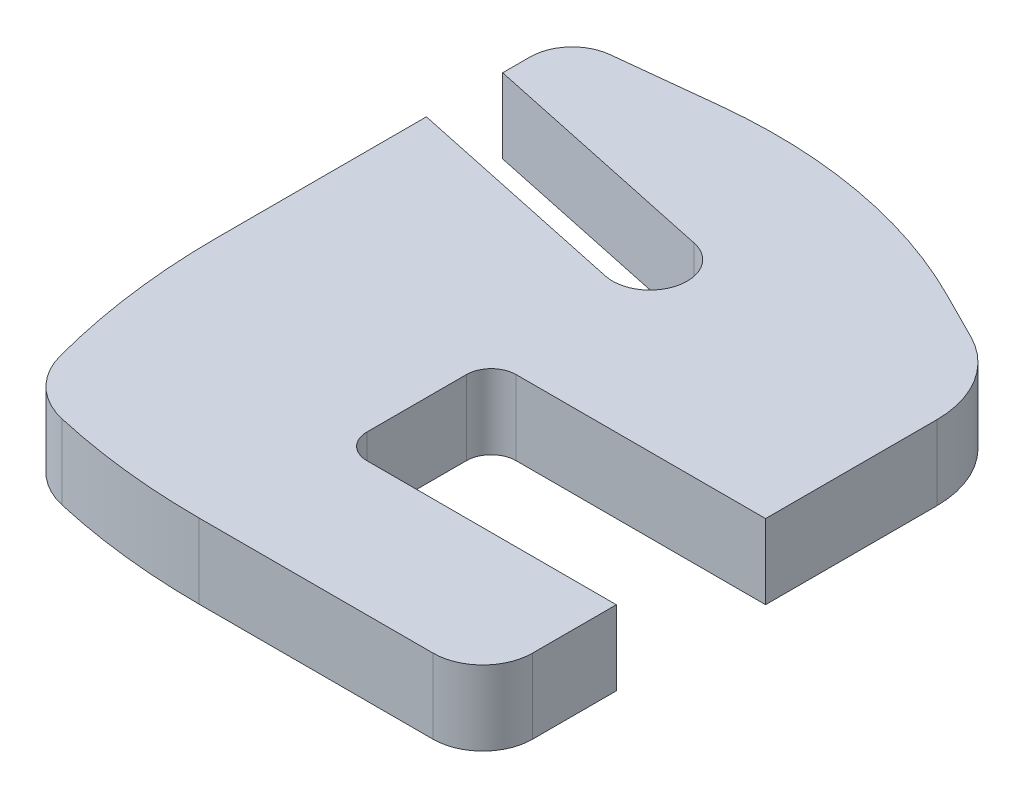
ISO-10303-21;
HEADER;
FILE_DESCRIPTION(('STEP AP214'),'2;1');
FILE_NAME('part.step','',(''),(''),'','','');
FILE_SCHEMA(('AUTOMOTIVE_DESIGN { 1 0 10303 214 1 1 1 1 }'));
ENDSEC;
DATA;
#1=APPLICATION_CONTEXT('core data for automotive mechanical design processes');
#2=APPLICATION_PROTOCOL_DEFINITION('international standard','automotive_design',2000,#1);
#3=PRODUCT_CONTEXT('',#1,'mechanical');
#4=PRODUCT('Part','Part','',(#3));
#5=PRODUCT_RELATED_PRODUCT_CATEGORY('part','',(#4));
#6=PRODUCT_DEFINITION_FORMATION('','',#4);
#7=PRODUCT_DEFINITION_CONTEXT('part definition',#1,'design');
#8=PRODUCT_DEFINITION('design','',#6,#7);
#9=PRODUCT_DEFINITION_SHAPE('','',#8);
#10=(LENGTH_UNIT() NAMED_UNIT(*) SI_UNIT(.MILLI.,.METRE.));
#11=(NAMED_UNIT(*) PLANE_ANGLE_UNIT() SI_UNIT($,.RADIAN.));
#12=(NAMED_UNIT(*) SI_UNIT($,.STERADIAN.) SOLID_ANGLE_UNIT());
#13=UNCERTAINTY_MEASURE_WITH_UNIT(LENGTH_MEASURE(1.E-05),#10,'distance_accuracy_value','');
#14=(GEOMETRIC_REPRESENTATION_CONTEXT(3) GLOBAL_UNCERTAINTY_ASSIGNED_CONTEXT((#13)) GLOBAL_UNIT_ASSIGNED_CONTEXT((#10,
#11,#12)) REPRESENTATION_CONTEXT('',''));
#15=CARTESIAN_POINT('',(0.,0.,0.));
#16=DIRECTION('',(0.,0.,1.));
#17=DIRECTION('',(1.,0.,0.));
#18=AXIS2_PLACEMENT_3D('',#15,#16,#17);
#19=CARTESIAN_POINT('',(-10.03,3.,-6.));
#20=DIRECTION('',(0.,0.,-1.));
#21=DIRECTION('',(-1.,0.,0.));
#22=AXIS2_PLACEMENT_3D('',#19,#20,#21);
#23=PLANE('',#22);
#24=DIRECTION('',(1.,0.,0.));
#25=VECTOR('',#24,1.);
#26=CARTESIAN_POINT('',(-10.03,0.,-6.));
#27=LINE('',#26,#25);
#28=CARTESIAN_POINT('',(-10.03,0.,-6.));
#29=VERTEX_POINT('',#28);
#30=CARTESIAN_POINT('',(0.,0.,-6.));
#31=VERTEX_POINT('',#30);
#32=EDGE_CURVE('E213',#29,#31,#27,.T.);
#33=ORIENTED_EDGE('',*,*,#32,.T.);
#34=DIRECTION('',(0.,-1.,0.));
#35=VECTOR('',#34,1.);
#36=CARTESIAN_POINT('',(0.,3.,-6.));
#37=LINE('',#36,#35);
#38=CARTESIAN_POINT('',(0.,3.,-6.));
#39=VERTEX_POINT('',#38);
#40=EDGE_CURVE('E11',#39,#31,#37,.T.);
#41=ORIENTED_EDGE('',*,*,#40,.F.);
#42=DIRECTION('',(1.,0.,0.));
#43=VECTOR('',#42,1.);
#44=CARTESIAN_POINT('',(-10.03,3.,-6.));
#45=LINE('',#44,#43);
#46=CARTESIAN_POINT('',(-10.03,3.,-6.));
#47=VERTEX_POINT('',#46);
#48=EDGE_CURVE('E255',#47,#39,#45,.T.);
#49=ORIENTED_EDGE('',*,*,#48,.F.);
#50=DIRECTION('',(0.,-1.,0.));
#51=VECTOR('',#50,1.);
#52=CARTESIAN_POINT('',(-10.03,3.,-6.));
#53=LINE('',#52,#51);
#54=EDGE_CURVE('E209',#47,#29,#53,.T.);
#55=ORIENTED_EDGE('',*,*,#54,.T.);
#56=EDGE_LOOP('',(#33,#41,#49,#55));
#57=FACE_BOUND('',#56,.T.);
#58=ADVANCED_FACE('F33',(#57),#23,.F.);
#59=CARTESIAN_POINT('',(0.,3.,-6.));
#60=DIRECTION('',(-1.,0.,0.));
#61=DIRECTION('',(0.,0.,1.));
#62=AXIS2_PLACEMENT_3D('',#59,#60,#61);
#63=PLANE('',#62);
#64=DIRECTION('',(0.,0.,-1.));
#65=VECTOR('',#64,1.);
#66=CARTESIAN_POINT('',(0.,0.,-6.));
#67=LINE('',#66,#65);
#68=CARTESIAN_POINT('',(0.,0.,-12.8856070370507));
#69=VERTEX_POINT('',#68);
#70=EDGE_CURVE('E216',#31,#69,#67,.T.);
#71=ORIENTED_EDGE('',*,*,#70,.T.);
#72=DIRECTION('',(0.,-1.,0.));
#73=VECTOR('',#72,1.);
#74=CARTESIAN_POINT('',(0.,3.,-12.8856070370507));
#75=LINE('',#74,#73);
#76=CARTESIAN_POINT('',(0.,3.,-12.8856070370507));
#77=VERTEX_POINT('',#76);
#78=EDGE_CURVE('E41',#77,#69,#75,.T.);
#79=ORIENTED_EDGE('',*,*,#78,.F.);
#80=DIRECTION('',(0.,0.,-1.));
#81=VECTOR('',#80,1.);
#82=CARTESIAN_POINT('',(0.,3.,-6.));
#83=LINE('',#82,#81);
#84=EDGE_CURVE('E134',#39,#77,#83,.T.);
#85=ORIENTED_EDGE('',*,*,#84,.F.);
#86=ORIENTED_EDGE('',*,*,#40,.T.);
#87=EDGE_LOOP('',(#71,#79,#85,#86));
#88=FACE_BOUND('',#87,.T.);
#89=ADVANCED_FACE('F383',(#88),#63,.F.);
#90=CARTESIAN_POINT('',(-4.,3.,-12.8856070370507));
#91=DIRECTION('',(0.,-1.,0.));
#92=DIRECTION('',(0.,0.,-1.));
#93=AXIS2_PLACEMENT_3D('',#90,#91,#92);
#94=CYLINDRICAL_SURFACE('',#93,4.);
#95=CARTESIAN_POINT('',(-4.,0.,-12.8856070370507));
#96=DIRECTION('',(0.,1.,0.));
#97=DIRECTION('',(0.,0.,1.));
#98=AXIS2_PLACEMENT_3D('',#95,#96,#97);
#99=CIRCLE('',#98,4.);
#100=CARTESIAN_POINT('',(-2.20112124581843,0.,-16.458286035751));
#101=VERTEX_POINT('',#100);
#102=EDGE_CURVE('E218',#69,#101,#99,.T.);
#103=ORIENTED_EDGE('',*,*,#102,.T.);
#104=DIRECTION('',(0.,-1.,0.));
#105=VECTOR('',#104,1.);
#106=CARTESIAN_POINT('',(-2.20112124581843,3.,-16.458286035751));
#107=LINE('',#106,#105);
#108=CARTESIAN_POINT('',(-2.20112124581843,3.,-16.458286035751));
#109=VERTEX_POINT('',#108);
#110=EDGE_CURVE('E304',#109,#101,#107,.T.);
#111=ORIENTED_EDGE('',*,*,#110,.F.);
#112=CARTESIAN_POINT('',(-4.,3.,-12.8856070370507));
#113=DIRECTION('',(0.,1.,0.));
#114=DIRECTION('',(0.,0.,1.));
#115=AXIS2_PLACEMENT_3D('',#112,#113,#114);
#116=CIRCLE('',#115,4.);
#117=EDGE_CURVE('E312',#77,#109,#116,.T.);
#118=ORIENTED_EDGE('',*,*,#117,.F.);
#119=ORIENTED_EDGE('',*,*,#78,.T.);
#120=EDGE_LOOP('',(#103,#111,#118,#119));
#121=FACE_BOUND('',#120,.T.);
#122=ADVANCED_FACE('F310',(#121),#94,.T.);
#123=CARTESIAN_POINT('',(-2.20112124581843,3.,-16.458286035751));
#124=DIRECTION('',(-0.449719688545393,0.,0.893169749675074));
#125=DIRECTION('',(0.893169749675074,0.,0.449719688545393));
#126=AXIS2_PLACEMENT_3D('',#123,#124,#125);
#127=PLANE('',#126);
#128=DIRECTION('',(-0.893169749675074,0.,-0.449719688545393));
#129=VECTOR('',#128,1.);
#130=CARTESIAN_POINT('',(-2.20112124581843,0.,-16.458286035751));
#131=LINE('',#130,#129);
#132=CARTESIAN_POINT('',(-4.1545055907025,0.,-17.4418341233461));
#133=VERTEX_POINT('',#132);
#134=EDGE_CURVE('E220',#101,#133,#131,.T.);
#135=ORIENTED_EDGE('',*,*,#134,.T.);
#136=DIRECTION('',(0.,-1.,0.));
#137=VECTOR('',#136,1.);
#138=CARTESIAN_POINT('',(-4.1545055907025,3.,-17.4418341233461));
#139=LINE('',#138,#137);
#140=CARTESIAN_POINT('',(-4.1545055907025,3.,-17.4418341233461));
#141=VERTEX_POINT('',#140);
#142=EDGE_CURVE('E301',#141,#133,#139,.T.);
#143=ORIENTED_EDGE('',*,*,#142,.F.);
#144=DIRECTION('',(-0.893169749675074,0.,-0.449719688545393));
#145=VECTOR('',#144,1.);
#146=CARTESIAN_POINT('',(-2.20112124581843,3.,-16.458286035751));
#147=LINE('',#146,#145);
#148=EDGE_CURVE('E330',#109,#141,#147,.T.);
#149=ORIENTED_EDGE('',*,*,#148,.F.);
#150=ORIENTED_EDGE('',*,*,#110,.T.);
#151=EDGE_LOOP('',(#135,#143,#149,#150));
#152=FACE_BOUND('',#151,.T.);
#153=ADVANCED_FACE('F321',(#152),#127,.F.);
#154=CARTESIAN_POINT('',(-13.1488993616103,3.,0.421560870155395));
#155=DIRECTION('',(0.,-1.,0.));
#156=DIRECTION('',(0.,0.,-1.));
#157=AXIS2_PLACEMENT_3D('',#154,#155,#156);
#158=CYLINDRICAL_SURFACE('',#157,20.);
#159=CARTESIAN_POINT('',(-13.1488993616103,0.,0.421560870155395));
#160=DIRECTION('',(0.,1.,0.));
#161=DIRECTION('',(0.,0.,1.));
#162=AXIS2_PLACEMENT_3D('',#159,#160,#161);
#163=CIRCLE('',#162,20.);
#164=CARTESIAN_POINT('',(-15.3098922070051,0.,-19.4613491261744));
#165=VERTEX_POINT('',#164);
#166=EDGE_CURVE('E222',#133,#165,#163,.T.);
#167=ORIENTED_EDGE('',*,*,#166,.T.);
#168=DIRECTION('',(0.,-1.,0.));
#169=VECTOR('',#168,1.);
#170=CARTESIAN_POINT('',(-15.3098922070051,3.,-19.4613491261744));
#171=LINE('',#170,#169);
#172=CARTESIAN_POINT('',(-15.3098922070051,3.,-19.4613491261744));
#173=VERTEX_POINT('',#172);
#174=EDGE_CURVE('E298',#173,#165,#171,.T.);
#175=ORIENTED_EDGE('',*,*,#174,.F.);
#176=CARTESIAN_POINT('',(-13.1488993616103,3.,0.421560870155395));
#177=DIRECTION('',(0.,1.,0.));
#178=DIRECTION('',(0.,0.,1.));
#179=AXIS2_PLACEMENT_3D('',#176,#177,#178);
#180=CIRCLE('',#179,20.);
#181=EDGE_CURVE('E327',#141,#173,#180,.T.);
#182=ORIENTED_EDGE('',*,*,#181,.F.);
#183=ORIENTED_EDGE('',*,*,#142,.T.);
#184=EDGE_LOOP('',(#167,#175,#182,#183));
#185=FACE_BOUND('',#184,.T.);
#186=ADVANCED_FACE('F325',(#185),#158,.T.);
#187=CARTESIAN_POINT('',(-15.3098922070051,3.,-19.4613491261744));
#188=DIRECTION('',(0.108049642269737,0.,0.994145499816491));
#189=DIRECTION('',(0.994145499816492,0.,-0.108049642269737));
#190=AXIS2_PLACEMENT_3D('',#187,#188,#189);
#191=PLANE('',#190);
#192=DIRECTION('',(-0.994145499816492,0.,0.108049642269737));
#193=VECTOR('',#192,1.);
#194=CARTESIAN_POINT('',(-15.3098922070051,0.,-19.4613491261744));
#195=LINE('',#194,#193);
#196=CARTESIAN_POINT('',(-19.2936843918586,0.,-19.0283669112674));
#197=VERTEX_POINT('',#196);
#198=EDGE_CURVE('E224',#165,#197,#195,.T.);
#199=ORIENTED_EDGE('',*,*,#198,.T.);
#200=DIRECTION('',(0.,-1.,0.));
#201=VECTOR('',#200,1.);
#202=CARTESIAN_POINT('',(-19.2936843918586,3.,-19.0283669112674));
#203=LINE('',#202,#201);
#204=CARTESIAN_POINT('',(-19.2936843918586,3.,-19.0283669112674));
#205=VERTEX_POINT('',#204);
#206=EDGE_CURVE('E295',#205,#197,#203,.T.);
#207=ORIENTED_EDGE('',*,*,#206,.F.);
#208=DIRECTION('',(-0.994145499816492,0.,0.108049642269737));
#209=VECTOR('',#208,1.);
#210=CARTESIAN_POINT('',(-15.3098922070051,3.,-19.4613491261744));
#211=LINE('',#210,#209);
#212=EDGE_CURVE('E329',#173,#205,#211,.T.);
#213=ORIENTED_EDGE('',*,*,#212,.F.);
#214=ORIENTED_EDGE('',*,*,#174,.T.);
#215=EDGE_LOOP('',(#199,#207,#213,#214));
#216=FACE_BOUND('',#215,.T.);
#217=ADVANCED_FACE('F396',(#216),#191,.F.);
#218=CARTESIAN_POINT('',(-19.11,3.,-17.3383195615794));
#219=DIRECTION('',(0.,-1.,0.));
#220=DIRECTION('',(0.,0.,-1.));
#221=AXIS2_PLACEMENT_3D('',#218,#219,#220);
#222=CYLINDRICAL_SURFACE('',#221,1.7);
#223=CARTESIAN_POINT('',(-19.11,0.,-17.3383195615794));
#224=DIRECTION('',(0.,1.,0.));
#225=DIRECTION('',(0.,0.,1.));
#226=AXIS2_PLACEMENT_3D('',#223,#224,#225);
#227=CIRCLE('',#226,1.7);
#228=CARTESIAN_POINT('',(-20.81,0.,-17.3383195615794));
#229=VERTEX_POINT('',#228);
#230=EDGE_CURVE('E226',#197,#229,#227,.T.);
#231=ORIENTED_EDGE('',*,*,#230,.T.);
#232=DIRECTION('',(0.,-1.,0.));
#233=VECTOR('',#232,1.);
#234=CARTESIAN_POINT('',(-20.81,3.,-17.3383195615794));
#235=LINE('',#234,#233);
#236=CARTESIAN_POINT('',(-20.81,3.,-17.3383195615794));
#237=VERTEX_POINT('',#236);
#238=EDGE_CURVE('E292',#237,#229,#235,.T.);
#239=ORIENTED_EDGE('',*,*,#238,.F.);
#240=CARTESIAN_POINT('',(-19.11,3.,-17.3383195615794));
#241=DIRECTION('',(0.,1.,0.));
#242=DIRECTION('',(0.,0.,1.));
#243=AXIS2_PLACEMENT_3D('',#240,#241,#242);
#244=CIRCLE('',#243,1.7);
#245=EDGE_CURVE('E332',#205,#237,#244,.T.);
#246=ORIENTED_EDGE('',*,*,#245,.F.);
#247=ORIENTED_EDGE('',*,*,#206,.T.);
#248=EDGE_LOOP('',(#231,#239,#246,#247));
#249=FACE_BOUND('',#248,.T.);
#250=ADVANCED_FACE('F399',(#249),#222,.T.);
#251=CARTESIAN_POINT('',(-20.81,3.,-17.3383195615794));
#252=DIRECTION('',(1.,0.,0.));
#253=DIRECTION('',(0.,0.,-1.));
#254=AXIS2_PLACEMENT_3D('',#251,#252,#253);
#255=PLANE('',#254);
#256=DIRECTION('',(0.,0.,1.));
#257=VECTOR('',#256,1.);
#258=CARTESIAN_POINT('',(-20.81,0.,-17.3383195615794));
#259=LINE('',#258,#257);
#260=CARTESIAN_POINT('',(-20.81,0.,-16.2388031731328));
#261=VERTEX_POINT('',#260);
#262=EDGE_CURVE('E228',#229,#261,#259,.T.);
#263=ORIENTED_EDGE('',*,*,#262,.T.);
#264=DIRECTION('',(0.,-1.,0.));
#265=VECTOR('',#264,1.);
#266=CARTESIAN_POINT('',(-20.81,3.,-16.2388031731328));
#267=LINE('',#266,#265);
#268=CARTESIAN_POINT('',(-20.81,3.,-16.2388031731328));
#269=VERTEX_POINT('',#268);
#270=EDGE_CURVE('E289',#269,#261,#267,.T.);
#271=ORIENTED_EDGE('',*,*,#270,.F.);
#272=DIRECTION('',(0.,0.,1.));
#273=VECTOR('',#272,1.);
#274=CARTESIAN_POINT('',(-20.81,3.,-17.3383195615794));
#275=LINE('',#274,#273);
#276=EDGE_CURVE('E338',#237,#269,#275,.T.);
#277=ORIENTED_EDGE('',*,*,#276,.F.);
#278=ORIENTED_EDGE('',*,*,#238,.T.);
#279=EDGE_LOOP('',(#263,#271,#277,#278));
#280=FACE_BOUND('',#279,.T.);
#281=ADVANCED_FACE('F403',(#280),#255,.F.);
#282=CARTESIAN_POINT('',(-20.81,3.,-16.2388031731328));
#283=DIRECTION('',(0.20791169081776,0.,-0.978147600733806));
#284=DIRECTION('',(-0.978147600733806,0.,-0.20791169081776));
#285=AXIS2_PLACEMENT_3D('',#282,#283,#284);
#286=PLANE('',#285);
#287=DIRECTION('',(0.978147600733806,0.,0.207911690817759));
#288=VECTOR('',#287,1.);
#289=CARTESIAN_POINT('',(-20.81,0.,-16.2388031731328));
#290=LINE('',#289,#288);
#291=CARTESIAN_POINT('',(-11.03,0.,-14.16));
#292=VERTEX_POINT('',#291);
#293=EDGE_CURVE('E230',#261,#292,#290,.T.);
#294=ORIENTED_EDGE('',*,*,#293,.T.);
#295=DIRECTION('',(0.,-1.,0.));
#296=VECTOR('',#295,1.);
#297=CARTESIAN_POINT('',(-11.03,3.,-14.16));
#298=LINE('',#297,#296);
#299=CARTESIAN_POINT('',(-11.03,3.,-14.16));
#300=VERTEX_POINT('',#299);
#301=EDGE_CURVE('E286',#300,#292,#298,.T.);
#302=ORIENTED_EDGE('',*,*,#301,.F.);
#303=DIRECTION('',(0.978147600733806,0.,0.207911690817759));
#304=VECTOR('',#303,1.);
#305=CARTESIAN_POINT('',(-20.81,3.,-16.2388031731328));
#306=LINE('',#305,#304);
#307=EDGE_CURVE('E340',#269,#300,#306,.T.);
#308=ORIENTED_EDGE('',*,*,#307,.F.);
#309=ORIENTED_EDGE('',*,*,#270,.T.);
#310=EDGE_LOOP('',(#294,#302,#308,#309));
#311=FACE_BOUND('',#310,.T.);
#312=ADVANCED_FACE('F407',(#311),#286,.F.);
#313=CARTESIAN_POINT('',(-11.3418675362266,3.,-12.6927785988993));
#314=DIRECTION('',(0.,-1.,0.));
#315=DIRECTION('',(0.,0.,-1.));
#316=AXIS2_PLACEMENT_3D('',#313,#314,#315);
#317=CYLINDRICAL_SURFACE('',#316,1.5);
#318=CARTESIAN_POINT('',(-11.3418675362266,0.,-12.6927785988993));
#319=DIRECTION('',(0.,-1.,0.));
#320=DIRECTION('',(0.,0.,-1.));
#321=AXIS2_PLACEMENT_3D('',#318,#319,#320);
#322=CIRCLE('',#321,1.5);
#323=CARTESIAN_POINT('',(-11.6537350724533,0.,-11.2255571977986));
#324=VERTEX_POINT('',#323);
#325=EDGE_CURVE('E232',#292,#324,#322,.T.);
#326=ORIENTED_EDGE('',*,*,#325,.T.);
#327=DIRECTION('',(0.,-1.,0.));
#328=VECTOR('',#327,1.);
#329=CARTESIAN_POINT('',(-11.6537350724533,3.,-11.2255571977986));
#330=LINE('',#329,#328);
#331=CARTESIAN_POINT('',(-11.6537350724533,3.,-11.2255571977986));
#332=VERTEX_POINT('',#331);
#333=EDGE_CURVE('E283',#332,#324,#330,.T.);
#334=ORIENTED_EDGE('',*,*,#333,.F.);
#335=CARTESIAN_POINT('',(-11.3418675362266,3.,-12.6927785988993));
#336=DIRECTION('',(0.,-1.,0.));
#337=DIRECTION('',(0.,0.,-1.));
#338=AXIS2_PLACEMENT_3D('',#335,#336,#337);
#339=CIRCLE('',#338,1.5);
#340=EDGE_CURVE('E342',#300,#332,#339,.T.);
#341=ORIENTED_EDGE('',*,*,#340,.F.);
#342=ORIENTED_EDGE('',*,*,#301,.T.);
#343=EDGE_LOOP('',(#326,#334,#341,#342));
#344=FACE_BOUND('',#343,.T.);
#345=ADVANCED_FACE('F411',(#344),#317,.F.);
#346=CARTESIAN_POINT('',(-11.6537350724533,3.,-11.2255571977986));
#347=DIRECTION('',(-0.207911690817759,0.,0.978147600733806));
#348=DIRECTION('',(0.978147600733806,0.,0.207911690817759));
#349=AXIS2_PLACEMENT_3D('',#346,#347,#348);
#350=PLANE('',#349);
#351=DIRECTION('',(-0.978147600733806,0.,-0.207911690817759));
#352=VECTOR('',#351,1.);
#353=CARTESIAN_POINT('',(-11.6537350724533,0.,-11.2255571977986));
#354=LINE('',#353,#352);
#355=CARTESIAN_POINT('',(-20.81,0.,-13.1717813885377));
#356=VERTEX_POINT('',#355);
#357=EDGE_CURVE('E234',#324,#356,#354,.T.);
#358=ORIENTED_EDGE('',*,*,#357,.T.);
#359=DIRECTION('',(0.,-1.,0.));
#360=VECTOR('',#359,1.);
#361=CARTESIAN_POINT('',(-20.81,3.,-13.1717813885377));
#362=LINE('',#361,#360);
#363=CARTESIAN_POINT('',(-20.81,3.,-13.1717813885377));
#364=VERTEX_POINT('',#363);
#365=EDGE_CURVE('E280',#364,#356,#362,.T.);
#366=ORIENTED_EDGE('',*,*,#365,.F.);
#367=DIRECTION('',(-0.978147600733806,0.,-0.207911690817759));
#368=VECTOR('',#367,1.);
#369=CARTESIAN_POINT('',(-11.6537350724533,3.,-11.2255571977986));
#370=LINE('',#369,#368);
#371=EDGE_CURVE('E344',#332,#364,#370,.T.);
#372=ORIENTED_EDGE('',*,*,#371,.F.);
#373=ORIENTED_EDGE('',*,*,#333,.T.);
#374=EDGE_LOOP('',(#358,#366,#372,#373));
#375=FACE_BOUND('',#374,.T.);
#376=ADVANCED_FACE('F415',(#375),#350,.F.);
#377=CARTESIAN_POINT('',(-20.81,3.,-13.1717813885377));
#378=DIRECTION('',(1.,0.,0.));
#379=DIRECTION('',(0.,0.,-1.));
#380=AXIS2_PLACEMENT_3D('',#377,#378,#379);
#381=PLANE('',#380);
#382=DIRECTION('',(0.,0.,1.));
#383=VECTOR('',#382,1.);
#384=CARTESIAN_POINT('',(-20.81,0.,-13.1717813885377));
#385=LINE('',#384,#383);
#386=CARTESIAN_POINT('',(-20.81,0.,-4.76675286600648));
#387=VERTEX_POINT('',#386);
#388=EDGE_CURVE('E236',#356,#387,#385,.T.);
#389=ORIENTED_EDGE('',*,*,#388,.T.);
#390=DIRECTION('',(0.,-1.,0.));
#391=VECTOR('',#390,1.);
#392=CARTESIAN_POINT('',(-20.81,3.,-4.76675286600648));
#393=LINE('',#392,#391);
#394=CARTESIAN_POINT('',(-20.81,3.,-4.76675286600648));
#395=VERTEX_POINT('',#394);
#396=EDGE_CURVE('E277',#395,#387,#393,.T.);
#397=ORIENTED_EDGE('',*,*,#396,.F.);
#398=DIRECTION('',(0.,0.,1.));
#399=VECTOR('',#398,1.);
#400=CARTESIAN_POINT('',(-20.81,3.,-13.1717813885377));
#401=LINE('',#400,#399);
#402=EDGE_CURVE('E346',#364,#395,#401,.T.);
#403=ORIENTED_EDGE('',*,*,#402,.F.);
#404=ORIENTED_EDGE('',*,*,#365,.T.);
#405=EDGE_LOOP('',(#389,#397,#403,#404));
#406=FACE_BOUND('',#405,.T.);
#407=ADVANCED_FACE('F419',(#406),#381,.F.);
#408=CARTESIAN_POINT('',(7.19,3.,-4.76675286600648));
#409=DIRECTION('',(0.,-1.,0.));
#410=DIRECTION('',(0.,0.,-1.));
#411=AXIS2_PLACEMENT_3D('',#408,#409,#410);
#412=CYLINDRICAL_SURFACE('',#411,28.);
#413=CARTESIAN_POINT('',(7.19,0.,-4.76675286600648));
#414=DIRECTION('',(0.,1.,0.));
#415=DIRECTION('',(0.,0.,-1.));
#416=AXIS2_PLACEMENT_3D('',#413,#414,#415);
#417=CIRCLE('',#416,28.);
#418=CARTESIAN_POINT('',(-19.8425353069473,0.,2.5299611121242));
#419=VERTEX_POINT('',#418);
#420=EDGE_CURVE('E238',#387,#419,#417,.T.);
#421=ORIENTED_EDGE('',*,*,#420,.T.);
#422=DIRECTION('',(0.,-1.,0.));
#423=VECTOR('',#422,1.);
#424=CARTESIAN_POINT('',(-19.8425353069473,3.,2.5299611121242));
#425=LINE('',#424,#423);
#426=CARTESIAN_POINT('',(-19.8425353069473,3.,2.5299611121242));
#427=VERTEX_POINT('',#426);
#428=EDGE_CURVE('E274',#427,#419,#425,.T.);
#429=ORIENTED_EDGE('',*,*,#428,.F.);
#430=CARTESIAN_POINT('',(7.19,3.,-4.76675286600648));
#431=DIRECTION('',(0.,1.,0.));
#432=DIRECTION('',(0.,0.,-1.));
#433=AXIS2_PLACEMENT_3D('',#430,#431,#432);
#434=CIRCLE('',#433,28.);
#435=EDGE_CURVE('E348',#395,#427,#434,.T.);
#436=ORIENTED_EDGE('',*,*,#435,.F.);
#437=ORIENTED_EDGE('',*,*,#396,.T.);
#438=EDGE_LOOP('',(#421,#429,#436,#437));
#439=FACE_BOUND('',#438,.T.);
#440=ADVANCED_FACE('F423',(#439),#412,.T.);
#441=CARTESIAN_POINT('',(-16.9461922383458,3.,1.74817032875306));
#442=DIRECTION('',(0.,-1.,0.));
#443=DIRECTION('',(0.,0.,-1.));
#444=AXIS2_PLACEMENT_3D('',#441,#442,#443);
#445=CYLINDRICAL_SURFACE('',#444,3.);
#446=CARTESIAN_POINT('',(-16.9461922383458,0.,1.74817032875306));
#447=DIRECTION('',(0.,1.,0.));
#448=DIRECTION('',(0.,0.,1.));
#449=AXIS2_PLACEMENT_3D('',#446,#447,#448);
#450=CIRCLE('',#449,3.);
#451=CARTESIAN_POINT('',(-17.6111353069473,0.,4.67355076820343));
#452=VERTEX_POINT('',#451);
#453=EDGE_CURVE('E240',#419,#452,#450,.T.);
#454=ORIENTED_EDGE('',*,*,#453,.T.);
#455=DIRECTION('',(0.,-1.,0.));
#456=VECTOR('',#455,1.);
#457=CARTESIAN_POINT('',(-17.6111353069473,3.,4.67355076820343));
#458=LINE('',#457,#456);
#459=CARTESIAN_POINT('',(-17.6111353069473,3.,4.67355076820343));
#460=VERTEX_POINT('',#459);
#461=EDGE_CURVE('E271',#460,#452,#458,.T.);
#462=ORIENTED_EDGE('',*,*,#461,.F.);
#463=CARTESIAN_POINT('',(-16.9461922383458,3.,1.74817032875306));
#464=DIRECTION('',(0.,1.,0.));
#465=DIRECTION('',(0.,0.,1.));
#466=AXIS2_PLACEMENT_3D('',#463,#464,#465);
#467=CIRCLE('',#466,3.);
#468=EDGE_CURVE('E350',#427,#460,#467,.T.);
#469=ORIENTED_EDGE('',*,*,#468,.F.);
#470=ORIENTED_EDGE('',*,*,#428,.T.);
#471=EDGE_LOOP('',(#454,#462,#469,#470));
#472=FACE_BOUND('',#471,.T.);
#473=ADVANCED_FACE('F427',(#472),#445,.T.);
#474=CARTESIAN_POINT('',(-11.405,3.,-22.63));
#475=DIRECTION('',(0.,-1.,0.));
#476=DIRECTION('',(0.,0.,-1.));
#477=AXIS2_PLACEMENT_3D('',#474,#475,#476);
#478=CYLINDRICAL_SURFACE('',#477,28.);
#479=CARTESIAN_POINT('',(-11.405,0.,-22.63));
#480=DIRECTION('',(0.,1.,0.));
#481=DIRECTION('',(0.,0.,1.));
#482=AXIS2_PLACEMENT_3D('',#479,#480,#481);
#483=CIRCLE('',#482,28.);
#484=CARTESIAN_POINT('',(-11.405,0.,5.37));
#485=VERTEX_POINT('',#484);
#486=EDGE_CURVE('E242',#452,#485,#483,.T.);
#487=ORIENTED_EDGE('',*,*,#486,.T.);
#488=DIRECTION('',(0.,-1.,0.));
#489=VECTOR('',#488,1.);
#490=CARTESIAN_POINT('',(-11.405,3.,5.37));
#491=LINE('',#490,#489);
#492=CARTESIAN_POINT('',(-11.405,3.,5.37));
#493=VERTEX_POINT('',#492);
#494=EDGE_CURVE('E268',#493,#485,#491,.T.);
#495=ORIENTED_EDGE('',*,*,#494,.F.);
#496=CARTESIAN_POINT('',(-11.405,3.,-22.63));
#497=DIRECTION('',(0.,1.,0.));
#498=DIRECTION('',(0.,0.,1.));
#499=AXIS2_PLACEMENT_3D('',#496,#497,#498);
#500=CIRCLE('',#499,28.);
#501=EDGE_CURVE('E352',#460,#493,#500,.T.);
#502=ORIENTED_EDGE('',*,*,#501,.F.);
#503=ORIENTED_EDGE('',*,*,#461,.T.);
#504=EDGE_LOOP('',(#487,#495,#502,#503));
#505=FACE_BOUND('',#504,.T.);
#506=ADVANCED_FACE('F431',(#505),#478,.T.);
#507=CARTESIAN_POINT('',(-11.405,3.,5.37));
#508=DIRECTION('',(0.,0.,-1.));
#509=DIRECTION('',(-1.,0.,0.));
#510=AXIS2_PLACEMENT_3D('',#507,#508,#509);
#511=PLANE('',#510);
#512=DIRECTION('',(1.,0.,0.));
#513=VECTOR('',#512,1.);
#514=CARTESIAN_POINT('',(-11.405,0.,5.37));
#515=LINE('',#514,#513);
#516=CARTESIAN_POINT('',(-2.00000000000001,0.,5.37));
#517=VERTEX_POINT('',#516);
#518=EDGE_CURVE('E244',#485,#517,#515,.T.);
#519=ORIENTED_EDGE('',*,*,#518,.T.);
#520=DIRECTION('',(0.,-1.,0.));
#521=VECTOR('',#520,1.);
#522=CARTESIAN_POINT('',(-2.00000000000001,3.,5.37));
#523=LINE('',#522,#521);
#524=CARTESIAN_POINT('',(-2.00000000000001,3.,5.37));
#525=VERTEX_POINT('',#524);
#526=EDGE_CURVE('E265',#525,#517,#523,.T.);
#527=ORIENTED_EDGE('',*,*,#526,.F.);
#528=DIRECTION('',(1.,0.,0.));
#529=VECTOR('',#528,1.);
#530=CARTESIAN_POINT('',(-11.405,3.,5.37));
#531=LINE('',#530,#529);
#532=EDGE_CURVE('E354',#493,#525,#531,.T.);
#533=ORIENTED_EDGE('',*,*,#532,.F.);
#534=ORIENTED_EDGE('',*,*,#494,.T.);
#535=EDGE_LOOP('',(#519,#527,#533,#534));
#536=FACE_BOUND('',#535,.T.);
#537=ADVANCED_FACE('F435',(#536),#511,.F.);
#538=CARTESIAN_POINT('',(-2.,3.,3.37));
#539=DIRECTION('',(0.,-1.,0.));
#540=DIRECTION('',(0.,0.,-1.));
#541=AXIS2_PLACEMENT_3D('',#538,#539,#540);
#542=CYLINDRICAL_SURFACE('',#541,2.);
#543=CARTESIAN_POINT('',(-2.,0.,3.37));
#544=DIRECTION('',(0.,1.,0.));
#545=DIRECTION('',(0.,0.,1.));
#546=AXIS2_PLACEMENT_3D('',#543,#544,#545);
#547=CIRCLE('',#546,2.);
#548=CARTESIAN_POINT('',(0.,0.,3.36999999999999));
#549=VERTEX_POINT('',#548);
#550=EDGE_CURVE('E246',#517,#549,#547,.T.);
#551=ORIENTED_EDGE('',*,*,#550,.T.);
#552=DIRECTION('',(0.,-1.,0.));
#553=VECTOR('',#552,1.);
#554=CARTESIAN_POINT('',(0.,3.,3.36999999999999));
#555=LINE('',#554,#553);
#556=CARTESIAN_POINT('',(0.,3.,3.36999999999999));
#557=VERTEX_POINT('',#556);
#558=EDGE_CURVE('E262',#557,#549,#555,.T.);
#559=ORIENTED_EDGE('',*,*,#558,.F.);
#560=CARTESIAN_POINT('',(-2.,3.,3.37));
#561=DIRECTION('',(0.,1.,0.));
#562=DIRECTION('',(0.,0.,1.));
#563=AXIS2_PLACEMENT_3D('',#560,#561,#562);
#564=CIRCLE('',#563,2.);
#565=EDGE_CURVE('E356',#525,#557,#564,.T.);
#566=ORIENTED_EDGE('',*,*,#565,.F.);
#567=ORIENTED_EDGE('',*,*,#526,.T.);
#568=EDGE_LOOP('',(#551,#559,#566,#567));
#569=FACE_BOUND('',#568,.T.);
#570=ADVANCED_FACE('F439',(#569),#542,.T.);
#571=CARTESIAN_POINT('',(0.,3.,3.36999999999999));
#572=DIRECTION('',(-1.,0.,0.));
#573=DIRECTION('',(0.,0.,1.));
#574=AXIS2_PLACEMENT_3D('',#571,#572,#573);
#575=PLANE('',#574);
#576=DIRECTION('',(0.,0.,-1.));
#577=VECTOR('',#576,1.);
#578=CARTESIAN_POINT('',(0.,0.,3.36999999999999));
#579=LINE('',#578,#577);
#580=CARTESIAN_POINT('',(0.,0.,0.));
#581=VERTEX_POINT('',#580);
#582=EDGE_CURVE('E248',#549,#581,#579,.T.);
#583=ORIENTED_EDGE('',*,*,#582,.T.);
#584=DIRECTION('',(0.,-1.,0.));
#585=VECTOR('',#584,1.);
#586=CARTESIAN_POINT('',(0.,3.,0.));
#587=LINE('',#586,#585);
#588=CARTESIAN_POINT('',(0.,3.,0.));
#589=VERTEX_POINT('',#588);
#590=EDGE_CURVE('E259',#589,#581,#587,.T.);
#591=ORIENTED_EDGE('',*,*,#590,.F.);
#592=DIRECTION('',(0.,0.,-1.));
#593=VECTOR('',#592,1.);
#594=CARTESIAN_POINT('',(0.,3.,3.36999999999999));
#595=LINE('',#594,#593);
#596=EDGE_CURVE('E358',#557,#589,#595,.T.);
#597=ORIENTED_EDGE('',*,*,#596,.F.);
#598=ORIENTED_EDGE('',*,*,#558,.T.);
#599=EDGE_LOOP('',(#583,#591,#597,#598));
#600=FACE_BOUND('',#599,.T.);
#601=ADVANCED_FACE('F364',(#600),#575,.F.);
#602=CARTESIAN_POINT('',(0.,3.,0.));
#603=DIRECTION('',(0.,0.,1.));
#604=DIRECTION('',(1.,0.,0.));
#605=AXIS2_PLACEMENT_3D('',#602,#603,#604);
#606=PLANE('',#605);
#607=DIRECTION('',(-1.,0.,0.));
#608=VECTOR('',#607,1.);
#609=CARTESIAN_POINT('',(0.,0.,0.));
#610=LINE('',#609,#608);
#611=CARTESIAN_POINT('',(-10.03,0.,0.));
#612=VERTEX_POINT('',#611);
#613=EDGE_CURVE('E250',#581,#612,#610,.T.);
#614=ORIENTED_EDGE('',*,*,#613,.T.);
#615=DIRECTION('',(0.,-1.,0.));
#616=VECTOR('',#615,1.);
#617=CARTESIAN_POINT('',(-10.03,3.,0.));
#618=LINE('',#617,#616);
#619=CARTESIAN_POINT('',(-10.03,3.,0.));
#620=VERTEX_POINT('',#619);
#621=EDGE_CURVE('E204',#620,#612,#618,.T.);
#622=ORIENTED_EDGE('',*,*,#621,.F.);
#623=DIRECTION('',(-1.,0.,0.));
#624=VECTOR('',#623,1.);
#625=CARTESIAN_POINT('',(0.,3.,0.));
#626=LINE('',#625,#624);
#627=EDGE_CURVE('E195',#589,#620,#626,.T.);
#628=ORIENTED_EDGE('',*,*,#627,.F.);
#629=ORIENTED_EDGE('',*,*,#590,.T.);
#630=EDGE_LOOP('',(#614,#622,#628,#629));
#631=FACE_BOUND('',#630,.T.);
#632=ADVANCED_FACE('F368',(#631),#606,.F.);
#633=CARTESIAN_POINT('',(-10.03,3.,-0.999999999999999));
#634=DIRECTION('',(0.,-1.,0.));
#635=DIRECTION('',(0.,0.,-1.));
#636=AXIS2_PLACEMENT_3D('',#633,#634,#635);
#637=CYLINDRICAL_SURFACE('',#636,1.);
#638=CARTESIAN_POINT('',(-10.03,0.,-0.999999999999999));
#639=DIRECTION('',(0.,-1.,0.));
#640=DIRECTION('',(0.,0.,-1.));
#641=AXIS2_PLACEMENT_3D('',#638,#639,#640);
#642=CIRCLE('',#641,1.);
#643=CARTESIAN_POINT('',(-11.03,0.,-1.00000000000001));
#644=VERTEX_POINT('',#643);
#645=EDGE_CURVE('E203',#612,#644,#642,.T.);
#646=ORIENTED_EDGE('',*,*,#645,.T.);
#647=DIRECTION('',(0.,-1.,0.));
#648=VECTOR('',#647,1.);
#649=CARTESIAN_POINT('',(-11.03,3.,-1.00000000000001));
#650=LINE('',#649,#648);
#651=CARTESIAN_POINT('',(-11.03,3.,-1.00000000000001));
#652=VERTEX_POINT('',#651);
#653=EDGE_CURVE('E200',#652,#644,#650,.T.);
#654=ORIENTED_EDGE('',*,*,#653,.F.);
#655=CARTESIAN_POINT('',(-10.03,3.,-0.999999999999999));
#656=DIRECTION('',(0.,-1.,0.));
#657=DIRECTION('',(0.,0.,-1.));
#658=AXIS2_PLACEMENT_3D('',#655,#656,#657);
#659=CIRCLE('',#658,1.);
#660=EDGE_CURVE('E189',#620,#652,#659,.T.);
#661=ORIENTED_EDGE('',*,*,#660,.F.);
#662=ORIENTED_EDGE('',*,*,#621,.T.);
#663=EDGE_LOOP('',(#646,#654,#661,#662));
#664=FACE_BOUND('',#663,.T.);
#665=ADVANCED_FACE('F201',(#664),#637,.F.);
#666=CARTESIAN_POINT('',(-11.03,3.,-1.00000000000001));
#667=DIRECTION('',(-1.,0.,0.));
#668=DIRECTION('',(0.,0.,1.));
#669=AXIS2_PLACEMENT_3D('',#666,#667,#668);
#670=PLANE('',#669);
#671=DIRECTION('',(0.,0.,-1.));
#672=VECTOR('',#671,1.);
#673=CARTESIAN_POINT('',(-11.03,0.,-1.00000000000001));
#674=LINE('',#673,#672);
#675=CARTESIAN_POINT('',(-11.03,0.,-5.));
#676=VERTEX_POINT('',#675);
#677=EDGE_CURVE('E120',#644,#676,#674,.T.);
#678=ORIENTED_EDGE('',*,*,#677,.T.);
#679=DIRECTION('',(0.,-1.,0.));
#680=VECTOR('',#679,1.);
#681=CARTESIAN_POINT('',(-11.03,3.,-5.));
#682=LINE('',#681,#680);
#683=CARTESIAN_POINT('',(-11.03,3.,-5.));
#684=VERTEX_POINT('',#683);
#685=EDGE_CURVE('E205',#684,#676,#682,.T.);
#686=ORIENTED_EDGE('',*,*,#685,.F.);
#687=DIRECTION('',(0.,0.,-1.));
#688=VECTOR('',#687,1.);
#689=CARTESIAN_POINT('',(-11.03,3.,-1.00000000000001));
#690=LINE('',#689,#688);
#691=EDGE_CURVE('E193',#652,#684,#690,.T.);
#692=ORIENTED_EDGE('',*,*,#691,.F.);
#693=ORIENTED_EDGE('',*,*,#653,.T.);
#694=EDGE_LOOP('',(#678,#686,#692,#693));
#695=FACE_BOUND('',#694,.T.);
#696=ADVANCED_FACE('F207',(#695),#670,.F.);
#697=CARTESIAN_POINT('',(-10.03,3.,-5.));
#698=DIRECTION('',(0.,-1.,0.));
#699=DIRECTION('',(0.,0.,-1.));
#700=AXIS2_PLACEMENT_3D('',#697,#698,#699);
#701=CYLINDRICAL_SURFACE('',#700,1.);
#702=CARTESIAN_POINT('',(-10.03,0.,-5.));
#703=DIRECTION('',(0.,-1.,0.));
#704=DIRECTION('',(0.,0.,-1.));
#705=AXIS2_PLACEMENT_3D('',#702,#703,#704);
#706=CIRCLE('',#705,1.);
#707=EDGE_CURVE('E126',#676,#29,#706,.T.);
#708=ORIENTED_EDGE('',*,*,#707,.T.);
#709=ORIENTED_EDGE('',*,*,#54,.F.);
#710=CARTESIAN_POINT('',(-10.03,3.,-5.));
#711=DIRECTION('',(0.,-1.,0.));
#712=DIRECTION('',(0.,0.,-1.));
#713=AXIS2_PLACEMENT_3D('',#710,#711,#712);
#714=CIRCLE('',#713,1.);
#715=EDGE_CURVE('E49',#684,#47,#714,.T.);
#716=ORIENTED_EDGE('',*,*,#715,.F.);
#717=ORIENTED_EDGE('',*,*,#685,.T.);
#718=EDGE_LOOP('',(#708,#709,#716,#717));
#719=FACE_BOUND('',#718,.T.);
#720=ADVANCED_FACE('F372',(#719),#701,.F.);
#721=CARTESIAN_POINT('',(-4.,3.,-12.8856070370507));
#722=DIRECTION('',(0.,1.,0.));
#723=DIRECTION('',(0.,0.,1.));
#724=AXIS2_PLACEMENT_3D('',#721,#722,#723);
#725=PLANE('',#724);
#726=ORIENTED_EDGE('',*,*,#48,.T.);
#727=ORIENTED_EDGE('',*,*,#84,.T.);
#728=ORIENTED_EDGE('',*,*,#117,.T.);
#729=ORIENTED_EDGE('',*,*,#148,.T.);
#730=ORIENTED_EDGE('',*,*,#181,.T.);
#731=ORIENTED_EDGE('',*,*,#212,.T.);
#732=ORIENTED_EDGE('',*,*,#245,.T.);
#733=ORIENTED_EDGE('',*,*,#276,.T.);
#734=ORIENTED_EDGE('',*,*,#307,.T.);
#735=ORIENTED_EDGE('',*,*,#340,.T.);
#736=ORIENTED_EDGE('',*,*,#371,.T.);
#737=ORIENTED_EDGE('',*,*,#402,.T.);
#738=ORIENTED_EDGE('',*,*,#435,.T.);
#739=ORIENTED_EDGE('',*,*,#468,.T.);
#740=ORIENTED_EDGE('',*,*,#501,.T.);
#741=ORIENTED_EDGE('',*,*,#532,.T.);
#742=ORIENTED_EDGE('',*,*,#565,.T.);
#743=ORIENTED_EDGE('',*,*,#596,.T.);
#744=ORIENTED_EDGE('',*,*,#627,.T.);
#745=ORIENTED_EDGE('',*,*,#660,.T.);
#746=ORIENTED_EDGE('',*,*,#691,.T.);
#747=ORIENTED_EDGE('',*,*,#715,.T.);
#748=EDGE_LOOP('',(#726,#727,#728,#729,#730,#731,#732,#733,#734,#735,#736,#737,#738,#739,#740,
#741,#742,#743,#744,#745,#746,#747));
#749=FACE_BOUND('',#748,.T.);
#750=ADVANCED_FACE('F191',(#749),#725,.T.);
#751=CARTESIAN_POINT('',(-4.,0.,-12.8856070370507));
#752=DIRECTION('',(0.,1.,0.));
#753=DIRECTION('',(0.,0.,1.));
#754=AXIS2_PLACEMENT_3D('',#751,#752,#753);
#755=PLANE('',#754);
#756=ORIENTED_EDGE('',*,*,#32,.F.);
#757=ORIENTED_EDGE('',*,*,#707,.F.);
#758=ORIENTED_EDGE('',*,*,#677,.F.);
#759=ORIENTED_EDGE('',*,*,#645,.F.);
#760=ORIENTED_EDGE('',*,*,#613,.F.);
#761=ORIENTED_EDGE('',*,*,#582,.F.);
#762=ORIENTED_EDGE('',*,*,#550,.F.);
#763=ORIENTED_EDGE('',*,*,#518,.F.);
#764=ORIENTED_EDGE('',*,*,#486,.F.);
#765=ORIENTED_EDGE('',*,*,#453,.F.);
#766=ORIENTED_EDGE('',*,*,#420,.F.);
#767=ORIENTED_EDGE('',*,*,#388,.F.);
#768=ORIENTED_EDGE('',*,*,#357,.F.);
#769=ORIENTED_EDGE('',*,*,#325,.F.);
#770=ORIENTED_EDGE('',*,*,#293,.F.);
#771=ORIENTED_EDGE('',*,*,#262,.F.);
#772=ORIENTED_EDGE('',*,*,#230,.F.);
#773=ORIENTED_EDGE('',*,*,#198,.F.);
#774=ORIENTED_EDGE('',*,*,#166,.F.);
#775=ORIENTED_EDGE('',*,*,#134,.F.);
#776=ORIENTED_EDGE('',*,*,#102,.F.);
#777=ORIENTED_EDGE('',*,*,#70,.F.);
#778=EDGE_LOOP('',(#756,#757,#758,#759,#760,#761,#762,#763,#764,#765,#766,#767,#768,#769,#770,
#771,#772,#773,#774,#775,#776,#777));
#779=FACE_BOUND('',#778,.T.);
#780=ADVANCED_FACE('F316',(#779),#755,.F.);
#781=CLOSED_SHELL('',(#58,#89,#122,#153,#186,#217,#250,#281,#312,#345,#376,#407,#440,#473,#506,
#537,#570,#601,#632,#665,#696,#720,#750,#780));
#782=MANIFOLD_SOLID_BREP('B2',#781);
#783=ADVANCED_BREP_SHAPE_REPRESENTATION('',(#18,#782),#14);
#784=SHAPE_DEFINITION_REPRESENTATION(#9,#783);
ENDSEC;
END-ISO-10303-21;
